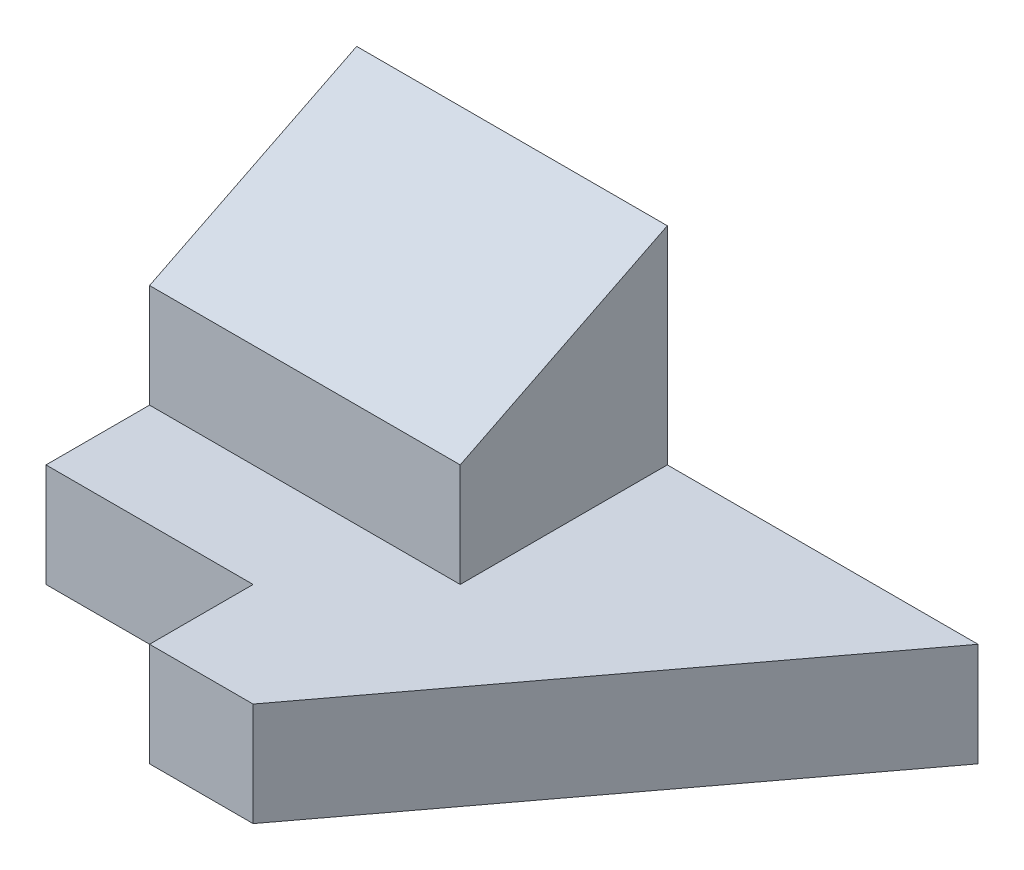
ISO-10303-21;
HEADER;
FILE_DESCRIPTION(('STEP AP214'),'2;1');
FILE_NAME('part.step','',(''),(''),'','','');
FILE_SCHEMA(('AUTOMOTIVE_DESIGN { 1 0 10303 214 1 1 1 1 }'));
ENDSEC;
DATA;
#1=APPLICATION_CONTEXT('core data for automotive mechanical design processes');
#2=APPLICATION_PROTOCOL_DEFINITION('international standard','automotive_design',2000,#1);
#3=PRODUCT_CONTEXT('',#1,'mechanical');
#4=PRODUCT('Part','Part','',(#3));
#5=PRODUCT_RELATED_PRODUCT_CATEGORY('part','',(#4));
#6=PRODUCT_DEFINITION_FORMATION('','',#4);
#7=PRODUCT_DEFINITION_CONTEXT('part definition',#1,'design');
#8=PRODUCT_DEFINITION('design','',#6,#7);
#9=PRODUCT_DEFINITION_SHAPE('','',#8);
#10=(LENGTH_UNIT() NAMED_UNIT(*) SI_UNIT(.MILLI.,.METRE.));
#11=(NAMED_UNIT(*) PLANE_ANGLE_UNIT() SI_UNIT($,.RADIAN.));
#12=(NAMED_UNIT(*) SI_UNIT($,.STERADIAN.) SOLID_ANGLE_UNIT());
#13=UNCERTAINTY_MEASURE_WITH_UNIT(LENGTH_MEASURE(1.E-05),#10,'distance_accuracy_value','');
#14=(GEOMETRIC_REPRESENTATION_CONTEXT(3) GLOBAL_UNCERTAINTY_ASSIGNED_CONTEXT((#13)) GLOBAL_UNIT_ASSIGNED_CONTEXT((#10,
#11,#12)) REPRESENTATION_CONTEXT('',''));
#15=CARTESIAN_POINT('',(0.,0.,0.));
#16=DIRECTION('',(0.,0.,1.));
#17=DIRECTION('',(1.,0.,0.));
#18=AXIS2_PLACEMENT_3D('',#15,#16,#17);
#19=CARTESIAN_POINT('',(21.1688311688312,10.,-33.6363636363636));
#20=DIRECTION('',(0.,0.,1.));
#21=DIRECTION('',(1.,0.,0.));
#22=AXIS2_PLACEMENT_3D('',#19,#20,#21);
#23=PLANE('',#22);
#24=DIRECTION('',(-1.,0.,0.));
#25=VECTOR('',#24,1.);
#26=CARTESIAN_POINT('',(21.1688311688312,0.,-33.6363636363636));
#27=LINE('',#26,#25);
#28=CARTESIAN_POINT('',(21.1688311688312,0.,-33.6363636363636));
#29=VERTEX_POINT('',#28);
#30=CARTESIAN_POINT('',(-38.8311688311688,0.,-33.6363636363636));
#31=VERTEX_POINT('',#30);
#32=EDGE_CURVE('E138',#29,#31,#27,.T.);
#33=ORIENTED_EDGE('',*,*,#32,.T.);
#34=DIRECTION('',(0.,-1.,0.));
#35=VECTOR('',#34,1.);
#36=CARTESIAN_POINT('',(-38.8311688311688,10.,-33.6363636363636));
#37=LINE('',#36,#35);
#38=CARTESIAN_POINT('',(-38.8311688311688,30.,-33.6363636363636));
#39=VERTEX_POINT('',#38);
#40=EDGE_CURVE('E11',#39,#31,#37,.T.);
#41=ORIENTED_EDGE('',*,*,#40,.F.);
#42=DIRECTION('',(-1.,0.,0.));
#43=VECTOR('',#42,1.);
#44=CARTESIAN_POINT('',(-8.83116883116883,30.,-33.6363636363636));
#45=LINE('',#44,#43);
#46=CARTESIAN_POINT('',(-8.83116883116883,30.,-33.6363636363636));
#47=VERTEX_POINT('',#46);
#48=EDGE_CURVE('E143',#47,#39,#45,.T.);
#49=ORIENTED_EDGE('',*,*,#48,.F.);
#50=DIRECTION('',(0.,1.,0.));
#51=VECTOR('',#50,1.);
#52=CARTESIAN_POINT('',(-8.83116883116883,10.,-33.6363636363636));
#53=LINE('',#52,#51);
#54=CARTESIAN_POINT('',(-8.83116883116883,10.,-33.6363636363636));
#55=VERTEX_POINT('',#54);
#56=EDGE_CURVE('E177',#55,#47,#53,.T.);
#57=ORIENTED_EDGE('',*,*,#56,.F.);
#58=DIRECTION('',(-1.,0.,0.));
#59=VECTOR('',#58,1.);
#60=CARTESIAN_POINT('',(21.1688311688312,10.,-33.6363636363636));
#61=LINE('',#60,#59);
#62=CARTESIAN_POINT('',(21.1688311688312,10.,-33.6363636363636));
#63=VERTEX_POINT('',#62);
#64=EDGE_CURVE('E156',#63,#55,#61,.T.);
#65=ORIENTED_EDGE('',*,*,#64,.F.);
#66=DIRECTION('',(0.,-1.,0.));
#67=VECTOR('',#66,1.);
#68=CARTESIAN_POINT('',(21.1688311688312,10.,-33.6363636363636));
#69=LINE('',#68,#67);
#70=EDGE_CURVE('E134',#63,#29,#69,.T.);
#71=ORIENTED_EDGE('',*,*,#70,.T.);
#72=EDGE_LOOP('',(#33,#41,#49,#57,#65,#71));
#73=FACE_BOUND('',#72,.T.);
#74=ADVANCED_FACE('F39',(#73),#23,.F.);
#75=CARTESIAN_POINT('',(-38.8311688311688,10.,-33.6363636363636));
#76=DIRECTION('',(1.,0.,0.));
#77=DIRECTION('',(0.,0.,-1.));
#78=AXIS2_PLACEMENT_3D('',#75,#76,#77);
#79=PLANE('',#78);
#80=DIRECTION('',(0.,0.,1.));
#81=VECTOR('',#80,1.);
#82=CARTESIAN_POINT('',(-38.8311688311688,0.,-33.6363636363636));
#83=LINE('',#82,#81);
#84=CARTESIAN_POINT('',(-38.8311688311688,0.,-3.63636363636364));
#85=VERTEX_POINT('',#84);
#86=EDGE_CURVE('E142',#31,#85,#83,.T.);
#87=ORIENTED_EDGE('',*,*,#86,.T.);
#88=DIRECTION('',(0.,-1.,0.));
#89=VECTOR('',#88,1.);
#90=CARTESIAN_POINT('',(-38.8311688311688,10.,-3.63636363636364));
#91=LINE('',#90,#89);
#92=CARTESIAN_POINT('',(-38.8311688311688,10.,-3.63636363636364));
#93=VERTEX_POINT('',#92);
#94=EDGE_CURVE('E47',#93,#85,#91,.T.);
#95=ORIENTED_EDGE('',*,*,#94,.F.);
#96=DIRECTION('',(0.,0.,1.));
#97=VECTOR('',#96,1.);
#98=CARTESIAN_POINT('',(-38.8311688311688,10.,-33.6363636363636));
#99=LINE('',#98,#97);
#100=CARTESIAN_POINT('',(-38.8311688311688,10.,-13.6363636363636));
#101=VERTEX_POINT('',#100);
#102=EDGE_CURVE('E97',#101,#93,#99,.T.);
#103=ORIENTED_EDGE('',*,*,#102,.F.);
#104=DIRECTION('',(0.,-1.,0.));
#105=VECTOR('',#104,1.);
#106=CARTESIAN_POINT('',(-38.8311688311688,20.,-13.6363636363636));
#107=LINE('',#106,#105);
#108=CARTESIAN_POINT('',(-38.8311688311688,20.,-13.6363636363636));
#109=VERTEX_POINT('',#108);
#110=EDGE_CURVE('E54',#109,#101,#107,.T.);
#111=ORIENTED_EDGE('',*,*,#110,.F.);
#112=DIRECTION('',(0.,-0.447213595499958,0.894427190999916));
#113=VECTOR('',#112,1.);
#114=CARTESIAN_POINT('',(-38.8311688311688,30.,-33.6363636363636));
#115=LINE('',#114,#113);
#116=EDGE_CURVE('E196',#39,#109,#115,.T.);
#117=ORIENTED_EDGE('',*,*,#116,.F.);
#118=ORIENTED_EDGE('',*,*,#40,.T.);
#119=EDGE_LOOP('',(#87,#95,#103,#111,#117,#118));
#120=FACE_BOUND('',#119,.T.);
#121=ADVANCED_FACE('F230',(#120),#79,.F.);
#122=CARTESIAN_POINT('',(-38.8311688311688,10.,-3.63636363636364));
#123=DIRECTION('',(0.,0.,-1.));
#124=DIRECTION('',(-1.,0.,0.));
#125=AXIS2_PLACEMENT_3D('',#122,#123,#124);
#126=PLANE('',#125);
#127=DIRECTION('',(1.,0.,0.));
#128=VECTOR('',#127,1.);
#129=CARTESIAN_POINT('',(-38.8311688311688,0.,-3.63636363636364));
#130=LINE('',#129,#128);
#131=CARTESIAN_POINT('',(-18.8311688311688,0.,-3.63636363636364));
#132=VERTEX_POINT('',#131);
#133=EDGE_CURVE('E146',#85,#132,#130,.T.);
#134=ORIENTED_EDGE('',*,*,#133,.T.);
#135=DIRECTION('',(0.,-1.,0.));
#136=VECTOR('',#135,1.);
#137=CARTESIAN_POINT('',(-18.8311688311688,10.,-3.63636363636364));
#138=LINE('',#137,#136);
#139=CARTESIAN_POINT('',(-18.8311688311688,10.,-3.63636363636364));
#140=VERTEX_POINT('',#139);
#141=EDGE_CURVE('E127',#140,#132,#138,.T.);
#142=ORIENTED_EDGE('',*,*,#141,.F.);
#143=DIRECTION('',(1.,0.,0.));
#144=VECTOR('',#143,1.);
#145=CARTESIAN_POINT('',(-38.8311688311688,10.,-3.63636363636364));
#146=LINE('',#145,#144);
#147=EDGE_CURVE('E113',#93,#140,#146,.T.);
#148=ORIENTED_EDGE('',*,*,#147,.F.);
#149=ORIENTED_EDGE('',*,*,#94,.T.);
#150=EDGE_LOOP('',(#134,#142,#148,#149));
#151=FACE_BOUND('',#150,.T.);
#152=ADVANCED_FACE('F166',(#151),#126,.F.);
#153=CARTESIAN_POINT('',(-18.8311688311688,10.,-3.63636363636364));
#154=DIRECTION('',(1.,0.,0.));
#155=DIRECTION('',(0.,0.,-1.));
#156=AXIS2_PLACEMENT_3D('',#153,#154,#155);
#157=PLANE('',#156);
#158=DIRECTION('',(0.,0.,1.));
#159=VECTOR('',#158,1.);
#160=CARTESIAN_POINT('',(-18.8311688311688,0.,-3.63636363636364));
#161=LINE('',#160,#159);
#162=CARTESIAN_POINT('',(-18.8311688311688,0.,6.36363636363637));
#163=VERTEX_POINT('',#162);
#164=EDGE_CURVE('E123',#132,#163,#161,.T.);
#165=ORIENTED_EDGE('',*,*,#164,.T.);
#166=DIRECTION('',(0.,-1.,0.));
#167=VECTOR('',#166,1.);
#168=CARTESIAN_POINT('',(-18.8311688311688,10.,6.36363636363637));
#169=LINE('',#168,#167);
#170=CARTESIAN_POINT('',(-18.8311688311688,10.,6.36363636363637));
#171=VERTEX_POINT('',#170);
#172=EDGE_CURVE('E120',#171,#163,#169,.T.);
#173=ORIENTED_EDGE('',*,*,#172,.F.);
#174=DIRECTION('',(0.,0.,1.));
#175=VECTOR('',#174,1.);
#176=CARTESIAN_POINT('',(-18.8311688311688,10.,-3.63636363636364));
#177=LINE('',#176,#175);
#178=EDGE_CURVE('E105',#140,#171,#177,.T.);
#179=ORIENTED_EDGE('',*,*,#178,.F.);
#180=ORIENTED_EDGE('',*,*,#141,.T.);
#181=EDGE_LOOP('',(#165,#173,#179,#180));
#182=FACE_BOUND('',#181,.T.);
#183=ADVANCED_FACE('F121',(#182),#157,.F.);
#184=CARTESIAN_POINT('',(-18.8311688311688,10.,6.36363636363637));
#185=DIRECTION('',(0.,0.,-1.));
#186=DIRECTION('',(-1.,0.,0.));
#187=AXIS2_PLACEMENT_3D('',#184,#185,#186);
#188=PLANE('',#187);
#189=DIRECTION('',(1.,0.,0.));
#190=VECTOR('',#189,1.);
#191=CARTESIAN_POINT('',(-18.8311688311688,0.,6.36363636363637));
#192=LINE('',#191,#190);
#193=CARTESIAN_POINT('',(-8.83116883116882,0.,6.36363636363637));
#194=VERTEX_POINT('',#193);
#195=EDGE_CURVE('E151',#163,#194,#192,.T.);
#196=ORIENTED_EDGE('',*,*,#195,.T.);
#197=DIRECTION('',(0.,-1.,0.));
#198=VECTOR('',#197,1.);
#199=CARTESIAN_POINT('',(-8.83116883116882,10.,6.36363636363637));
#200=LINE('',#199,#198);
#201=CARTESIAN_POINT('',(-8.83116883116882,10.,6.36363636363637));
#202=VERTEX_POINT('',#201);
#203=EDGE_CURVE('E128',#202,#194,#200,.T.);
#204=ORIENTED_EDGE('',*,*,#203,.F.);
#205=DIRECTION('',(1.,0.,0.));
#206=VECTOR('',#205,1.);
#207=CARTESIAN_POINT('',(-18.8311688311688,10.,6.36363636363637));
#208=LINE('',#207,#206);
#209=EDGE_CURVE('E110',#171,#202,#208,.T.);
#210=ORIENTED_EDGE('',*,*,#209,.F.);
#211=ORIENTED_EDGE('',*,*,#172,.T.);
#212=EDGE_LOOP('',(#196,#204,#210,#211));
#213=FACE_BOUND('',#212,.T.);
#214=ADVANCED_FACE('F130',(#213),#188,.F.);
#215=CARTESIAN_POINT('',(-8.83116883116882,10.,6.36363636363637));
#216=DIRECTION('',(-0.8,0.,-0.6));
#217=DIRECTION('',(-0.6,0.,0.8));
#218=AXIS2_PLACEMENT_3D('',#215,#216,#217);
#219=PLANE('',#218);
#220=DIRECTION('',(0.6,0.,-0.8));
#221=VECTOR('',#220,1.);
#222=CARTESIAN_POINT('',(-8.83116883116882,0.,6.36363636363637));
#223=LINE('',#222,#221);
#224=EDGE_CURVE('E90',#194,#29,#223,.T.);
#225=ORIENTED_EDGE('',*,*,#224,.T.);
#226=ORIENTED_EDGE('',*,*,#70,.F.);
#227=DIRECTION('',(0.6,0.,-0.8));
#228=VECTOR('',#227,1.);
#229=CARTESIAN_POINT('',(-8.83116883116882,10.,6.36363636363637));
#230=LINE('',#229,#228);
#231=EDGE_CURVE('E63',#202,#63,#230,.T.);
#232=ORIENTED_EDGE('',*,*,#231,.F.);
#233=ORIENTED_EDGE('',*,*,#203,.T.);
#234=EDGE_LOOP('',(#225,#226,#232,#233));
#235=FACE_BOUND('',#234,.T.);
#236=ADVANCED_FACE('F171',(#235),#219,.F.);
#237=CARTESIAN_POINT('',(0.,10.,0.));
#238=DIRECTION('',(0.,1.,0.));
#239=DIRECTION('',(0.,0.,1.));
#240=AXIS2_PLACEMENT_3D('',#237,#238,#239);
#241=PLANE('',#240);
#242=DIRECTION('',(0.,0.,-1.));
#243=VECTOR('',#242,1.);
#244=CARTESIAN_POINT('',(-8.83116883116882,10.,-13.6363636363636));
#245=LINE('',#244,#243);
#246=CARTESIAN_POINT('',(-8.83116883116882,10.,-13.6363636363636));
#247=VERTEX_POINT('',#246);
#248=EDGE_CURVE('E193',#247,#55,#245,.T.);
#249=ORIENTED_EDGE('',*,*,#248,.F.);
#250=DIRECTION('',(-1.,0.,0.));
#251=VECTOR('',#250,1.);
#252=CARTESIAN_POINT('',(-8.83116883116882,10.,-13.6363636363636));
#253=LINE('',#252,#251);
#254=EDGE_CURVE('E190',#247,#101,#253,.T.);
#255=ORIENTED_EDGE('',*,*,#254,.T.);
#256=ORIENTED_EDGE('',*,*,#102,.T.);
#257=ORIENTED_EDGE('',*,*,#147,.T.);
#258=ORIENTED_EDGE('',*,*,#178,.T.);
#259=ORIENTED_EDGE('',*,*,#209,.T.);
#260=ORIENTED_EDGE('',*,*,#231,.T.);
#261=ORIENTED_EDGE('',*,*,#64,.T.);
#262=EDGE_LOOP('',(#249,#255,#256,#257,#258,#259,#260,#261));
#263=FACE_BOUND('',#262,.T.);
#264=ADVANCED_FACE('F108',(#263),#241,.T.);
#265=CARTESIAN_POINT('',(0.,0.,0.));
#266=DIRECTION('',(0.,1.,0.));
#267=DIRECTION('',(0.,0.,1.));
#268=AXIS2_PLACEMENT_3D('',#265,#266,#267);
#269=PLANE('',#268);
#270=ORIENTED_EDGE('',*,*,#32,.F.);
#271=ORIENTED_EDGE('',*,*,#224,.F.);
#272=ORIENTED_EDGE('',*,*,#195,.F.);
#273=ORIENTED_EDGE('',*,*,#164,.F.);
#274=ORIENTED_EDGE('',*,*,#133,.F.);
#275=ORIENTED_EDGE('',*,*,#86,.F.);
#276=EDGE_LOOP('',(#270,#271,#272,#273,#274,#275));
#277=FACE_BOUND('',#276,.T.);
#278=ADVANCED_FACE('F170',(#277),#269,.F.);
#279=CARTESIAN_POINT('',(-8.83116883116883,30.,-33.6363636363636));
#280=DIRECTION('',(0.,-0.894427190999916,-0.447213595499958));
#281=DIRECTION('',(0.,0.447213595499958,-0.894427190999916));
#282=AXIS2_PLACEMENT_3D('',#279,#280,#281);
#283=PLANE('',#282);
#284=ORIENTED_EDGE('',*,*,#116,.T.);
#285=DIRECTION('',(-1.,0.,0.));
#286=VECTOR('',#285,1.);
#287=CARTESIAN_POINT('',(-8.83116883116882,20.,-13.6363636363636));
#288=LINE('',#287,#286);
#289=CARTESIAN_POINT('',(-8.83116883116882,20.,-13.6363636363636));
#290=VERTEX_POINT('',#289);
#291=EDGE_CURVE('E187',#290,#109,#288,.T.);
#292=ORIENTED_EDGE('',*,*,#291,.F.);
#293=DIRECTION('',(0.,-0.447213595499958,0.894427190999916));
#294=VECTOR('',#293,1.);
#295=CARTESIAN_POINT('',(-8.83116883116883,30.,-33.6363636363636));
#296=LINE('',#295,#294);
#297=EDGE_CURVE('E207',#47,#290,#296,.T.);
#298=ORIENTED_EDGE('',*,*,#297,.F.);
#299=ORIENTED_EDGE('',*,*,#48,.T.);
#300=EDGE_LOOP('',(#284,#292,#298,#299));
#301=FACE_BOUND('',#300,.T.);
#302=ADVANCED_FACE('F223',(#301),#283,.F.);
#303=CARTESIAN_POINT('',(-8.83116883116882,20.,-13.6363636363636));
#304=DIRECTION('',(0.,0.,-1.));
#305=DIRECTION('',(-1.,0.,0.));
#306=AXIS2_PLACEMENT_3D('',#303,#304,#305);
#307=PLANE('',#306);
#308=ORIENTED_EDGE('',*,*,#110,.T.);
#309=ORIENTED_EDGE('',*,*,#254,.F.);
#310=DIRECTION('',(0.,-1.,0.));
#311=VECTOR('',#310,1.);
#312=CARTESIAN_POINT('',(-8.83116883116882,20.,-13.6363636363636));
#313=LINE('',#312,#311);
#314=EDGE_CURVE('E203',#290,#247,#313,.T.);
#315=ORIENTED_EDGE('',*,*,#314,.F.);
#316=ORIENTED_EDGE('',*,*,#291,.T.);
#317=EDGE_LOOP('',(#308,#309,#315,#316));
#318=FACE_BOUND('',#317,.T.);
#319=ADVANCED_FACE('F229',(#318),#307,.F.);
#320=CARTESIAN_POINT('',(-8.83116883116882,0.,0.));
#321=DIRECTION('',(-1.,0.,0.));
#322=DIRECTION('',(0.,0.,1.));
#323=AXIS2_PLACEMENT_3D('',#320,#321,#322);
#324=PLANE('',#323);
#325=ORIENTED_EDGE('',*,*,#56,.T.);
#326=ORIENTED_EDGE('',*,*,#297,.T.);
#327=ORIENTED_EDGE('',*,*,#314,.T.);
#328=ORIENTED_EDGE('',*,*,#248,.T.);
#329=EDGE_LOOP('',(#325,#326,#327,#328));
#330=FACE_BOUND('',#329,.T.);
#331=ADVANCED_FACE('F214',(#330),#324,.F.);
#332=CLOSED_SHELL('',(#74,#121,#152,#183,#214,#236,#264,#278,#302,#319,#331));
#333=MANIFOLD_SOLID_BREP('B2',#332);
#334=ADVANCED_BREP_SHAPE_REPRESENTATION('',(#18,#333),#14);
#335=SHAPE_DEFINITION_REPRESENTATION(#9,#334);
ENDSEC;
END-ISO-10303-21;
